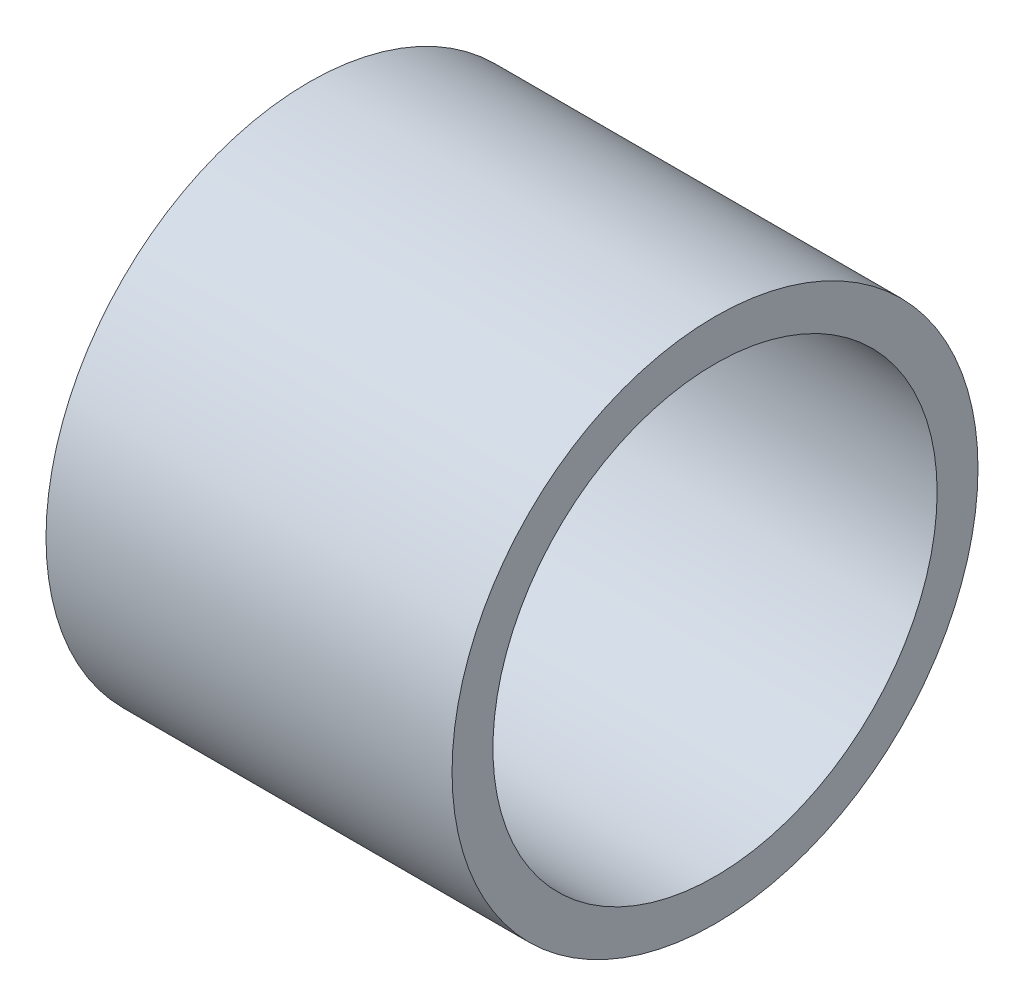
ISO-10303-21;
HEADER;
FILE_DESCRIPTION(('STEP AP214'),'2;1');
FILE_NAME('part.step','',(''),(''),'','','');
FILE_SCHEMA(('AUTOMOTIVE_DESIGN { 1 0 10303 214 1 1 1 1 }'));
ENDSEC;
DATA;
#1=APPLICATION_CONTEXT('core data for automotive mechanical design processes');
#2=APPLICATION_PROTOCOL_DEFINITION('international standard','automotive_design',2000,#1);
#3=PRODUCT_CONTEXT('',#1,'mechanical');
#4=PRODUCT('Part','Part','',(#3));
#5=PRODUCT_RELATED_PRODUCT_CATEGORY('part','',(#4));
#6=PRODUCT_DEFINITION_FORMATION('','',#4);
#7=PRODUCT_DEFINITION_CONTEXT('part definition',#1,'design');
#8=PRODUCT_DEFINITION('design','',#6,#7);
#9=PRODUCT_DEFINITION_SHAPE('','',#8);
#10=(LENGTH_UNIT() NAMED_UNIT(*) SI_UNIT(.MILLI.,.METRE.));
#11=(NAMED_UNIT(*) PLANE_ANGLE_UNIT() SI_UNIT($,.RADIAN.));
#12=(NAMED_UNIT(*) SI_UNIT($,.STERADIAN.) SOLID_ANGLE_UNIT());
#13=UNCERTAINTY_MEASURE_WITH_UNIT(LENGTH_MEASURE(1.E-05),#10,'distance_accuracy_value','');
#14=(GEOMETRIC_REPRESENTATION_CONTEXT(3) GLOBAL_UNCERTAINTY_ASSIGNED_CONTEXT((#13)) GLOBAL_UNIT_ASSIGNED_CONTEXT((#10,
#11,#12)) REPRESENTATION_CONTEXT('',''));
#15=CARTESIAN_POINT('',(0.,0.,0.));
#16=DIRECTION('',(0.,0.,1.));
#17=DIRECTION('',(1.,0.,0.));
#18=AXIS2_PLACEMENT_3D('',#15,#16,#17);
#19=CARTESIAN_POINT('',(-14.9,0.,0.));
#20=DIRECTION('',(1.,0.,0.));
#21=DIRECTION('',(0.,0.,-1.));
#22=AXIS2_PLACEMENT_3D('',#19,#20,#21);
#23=CYLINDRICAL_SURFACE('',#22,9.65);
#24=CARTESIAN_POINT('',(-14.9,0.,0.));
#25=DIRECTION('',(1.,0.,0.));
#26=DIRECTION('',(0.,0.,-1.));
#27=AXIS2_PLACEMENT_3D('',#24,#25,#26);
#28=CIRCLE('',#27,9.65);
#29=CARTESIAN_POINT('',(-14.9,0.,-9.65));
#30=VERTEX_POINT('',#29);
#31=EDGE_CURVE('E10',#30,#30,#28,.T.);
#32=ORIENTED_EDGE('',*,*,#31,.T.);
#33=EDGE_LOOP('',(#32));
#34=FACE_BOUND('',#33,.T.);
#35=CARTESIAN_POINT('',(0.,0.,0.));
#36=DIRECTION('',(1.,0.,0.));
#37=DIRECTION('',(0.,0.,-1.));
#38=AXIS2_PLACEMENT_3D('',#35,#36,#37);
#39=CIRCLE('',#38,9.65);
#40=CARTESIAN_POINT('',(0.,0.,-9.65));
#41=VERTEX_POINT('',#40);
#42=EDGE_CURVE('E40',#41,#41,#39,.T.);
#43=ORIENTED_EDGE('',*,*,#42,.F.);
#44=EDGE_LOOP('',(#43));
#45=FACE_BOUND('',#44,.T.);
#46=ADVANCED_FACE('F37',(#34,#45),#23,.T.);
#47=CARTESIAN_POINT('',(-14.9,0.,0.));
#48=DIRECTION('',(1.,0.,0.));
#49=DIRECTION('',(0.,0.,-1.));
#50=AXIS2_PLACEMENT_3D('',#47,#48,#49);
#51=PLANE('',#50);
#52=CARTESIAN_POINT('',(-14.9,0.,0.));
#53=DIRECTION('',(1.,0.,0.));
#54=DIRECTION('',(0.,0.,-1.));
#55=AXIS2_PLACEMENT_3D('',#52,#53,#54);
#56=CIRCLE('',#55,8.15);
#57=CARTESIAN_POINT('',(-14.9,0.,-8.15));
#58=VERTEX_POINT('',#57);
#59=EDGE_CURVE('E47',#58,#58,#56,.T.);
#60=ORIENTED_EDGE('',*,*,#59,.T.);
#61=EDGE_LOOP('',(#60));
#62=FACE_BOUND('',#61,.T.);
#63=ORIENTED_EDGE('',*,*,#31,.F.);
#64=EDGE_LOOP('',(#63));
#65=FACE_BOUND('',#64,.T.);
#66=ADVANCED_FACE('F55',(#62,#65),#51,.F.);
#67=CARTESIAN_POINT('',(0.,0.,0.));
#68=DIRECTION('',(1.,0.,0.));
#69=DIRECTION('',(0.,0.,-1.));
#70=AXIS2_PLACEMENT_3D('',#67,#68,#69);
#71=PLANE('',#70);
#72=CARTESIAN_POINT('',(0.,0.,0.));
#73=DIRECTION('',(1.,0.,0.));
#74=DIRECTION('',(0.,0.,-1.));
#75=AXIS2_PLACEMENT_3D('',#72,#73,#74);
#76=CIRCLE('',#75,8.15);
#77=CARTESIAN_POINT('',(0.,0.,-8.15));
#78=VERTEX_POINT('',#77);
#79=EDGE_CURVE('E49',#78,#78,#76,.T.);
#80=ORIENTED_EDGE('',*,*,#79,.F.);
#81=EDGE_LOOP('',(#80));
#82=FACE_BOUND('',#81,.T.);
#83=ORIENTED_EDGE('',*,*,#42,.T.);
#84=EDGE_LOOP('',(#83));
#85=FACE_BOUND('',#84,.T.);
#86=ADVANCED_FACE('F61',(#82,#85),#71,.T.);
#87=CARTESIAN_POINT('',(-14.9,0.,0.));
#88=DIRECTION('',(1.,0.,0.));
#89=DIRECTION('',(0.,0.,-1.));
#90=AXIS2_PLACEMENT_3D('',#87,#88,#89);
#91=CYLINDRICAL_SURFACE('',#90,8.15);
#92=ORIENTED_EDGE('',*,*,#59,.F.);
#93=EDGE_LOOP('',(#92));
#94=FACE_BOUND('',#93,.T.);
#95=ORIENTED_EDGE('',*,*,#79,.T.);
#96=EDGE_LOOP('',(#95));
#97=FACE_BOUND('',#96,.T.);
#98=ADVANCED_FACE('F58',(#94,#97),#91,.F.);
#99=CLOSED_SHELL('',(#46,#66,#86,#98));
#100=MANIFOLD_SOLID_BREP('B2',#99);
#101=ADVANCED_BREP_SHAPE_REPRESENTATION('',(#18,#100),#14);
#102=SHAPE_DEFINITION_REPRESENTATION(#9,#101);
ENDSEC;
END-ISO-10303-21;
